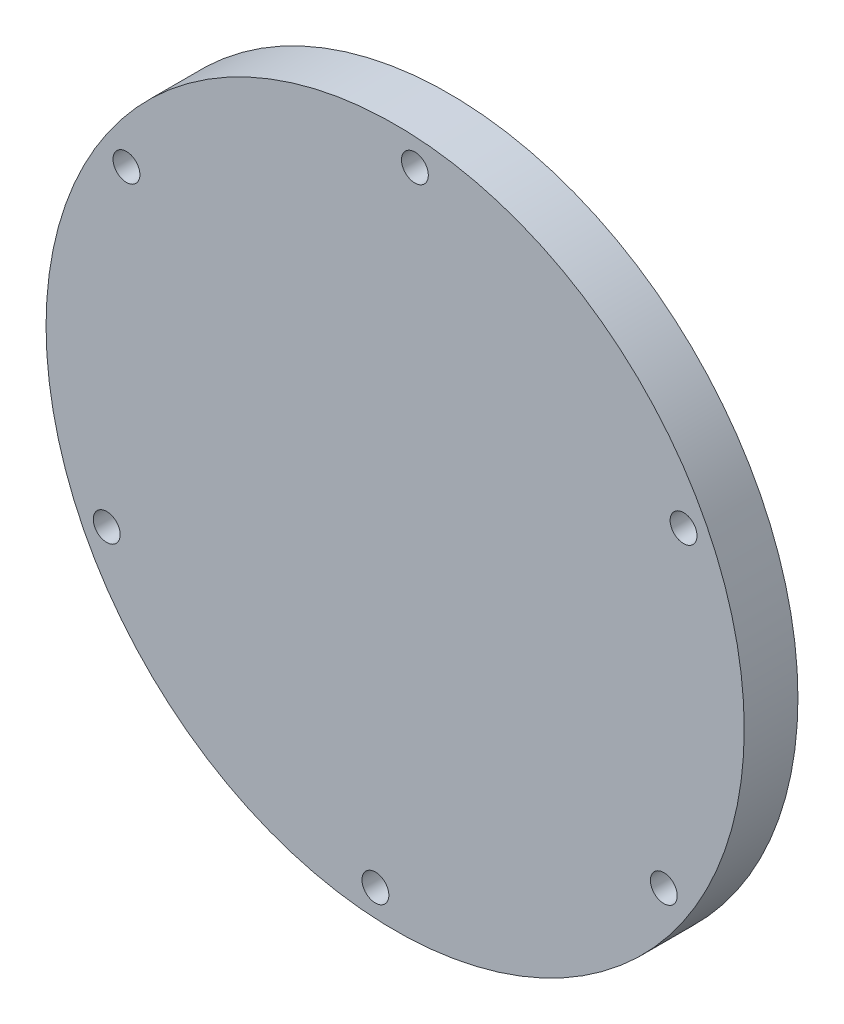
ISO-10303-21;
HEADER;
FILE_DESCRIPTION(('STEP AP214'),'2;1');
FILE_NAME('part.step','',(''),(''),'','','');
FILE_SCHEMA(('AUTOMOTIVE_DESIGN { 1 0 10303 214 1 1 1 1 }'));
ENDSEC;
DATA;
#1=APPLICATION_CONTEXT('core data for automotive mechanical design processes');
#2=APPLICATION_PROTOCOL_DEFINITION('international standard','automotive_design',2000,#1);
#3=PRODUCT_CONTEXT('',#1,'mechanical');
#4=PRODUCT('Part','Part','',(#3));
#5=PRODUCT_RELATED_PRODUCT_CATEGORY('part','',(#4));
#6=PRODUCT_DEFINITION_FORMATION('','',#4);
#7=PRODUCT_DEFINITION_CONTEXT('part definition',#1,'design');
#8=PRODUCT_DEFINITION('design','',#6,#7);
#9=PRODUCT_DEFINITION_SHAPE('','',#8);
#10=(LENGTH_UNIT() NAMED_UNIT(*) SI_UNIT(.MILLI.,.METRE.));
#11=(NAMED_UNIT(*) PLANE_ANGLE_UNIT() SI_UNIT($,.RADIAN.));
#12=(NAMED_UNIT(*) SI_UNIT($,.STERADIAN.) SOLID_ANGLE_UNIT());
#13=UNCERTAINTY_MEASURE_WITH_UNIT(LENGTH_MEASURE(1.E-05),#10,'distance_accuracy_value','');
#14=(GEOMETRIC_REPRESENTATION_CONTEXT(3) GLOBAL_UNCERTAINTY_ASSIGNED_CONTEXT((#13)) GLOBAL_UNIT_ASSIGNED_CONTEXT((#10,
#11,#12)) REPRESENTATION_CONTEXT('',''));
#15=CARTESIAN_POINT('',(0.,0.,0.));
#16=DIRECTION('',(0.,0.,1.));
#17=DIRECTION('',(1.,0.,0.));
#18=AXIS2_PLACEMENT_3D('',#15,#16,#17);
#19=CARTESIAN_POINT('',(-50.0261760262943,33.1267522130713,10.001));
#20=DIRECTION('',(0.,0.,-1.));
#21=DIRECTION('',(-1.,0.,0.));
#22=AXIS2_PLACEMENT_3D('',#19,#20,#21);
#23=CYLINDRICAL_SURFACE('',#22,2.5);
#24=CARTESIAN_POINT('',(-50.0261760262943,33.1267522130713,10.));
#25=DIRECTION('',(0.,0.,1.));
#26=DIRECTION('',(1.,0.,0.));
#27=AXIS2_PLACEMENT_3D('',#24,#25,#26);
#28=CIRCLE('',#27,2.5);
#29=CARTESIAN_POINT('',(-47.5261760262943,33.1267522130713,10.));
#30=VERTEX_POINT('',#29);
#31=EDGE_CURVE('E62',#30,#30,#28,.F.);
#32=ORIENTED_EDGE('',*,*,#31,.F.);
#33=EDGE_LOOP('',(#32));
#34=FACE_BOUND('',#33,.T.);
#35=CARTESIAN_POINT('',(-50.0261760262943,33.1267522130713,5.));
#36=DIRECTION('',(0.,0.,-1.));
#37=DIRECTION('',(-1.,0.,0.));
#38=AXIS2_PLACEMENT_3D('',#35,#36,#37);
#39=CIRCLE('',#38,2.5);
#40=CARTESIAN_POINT('',(-52.5261760262943,33.1267522130713,5.));
#41=VERTEX_POINT('',#40);
#42=EDGE_CURVE('E48',#41,#41,#39,.F.);
#43=ORIENTED_EDGE('',*,*,#42,.F.);
#44=EDGE_LOOP('',(#43));
#45=FACE_BOUND('',#44,.T.);
#46=ADVANCED_FACE('F44',(#34,#45),#23,.F.);
#47=CARTESIAN_POINT('',(-53.7016969745392,-26.7605631864274,10.001));
#48=DIRECTION('',(0.,0.,-1.));
#49=DIRECTION('',(-1.,0.,0.));
#50=AXIS2_PLACEMENT_3D('',#47,#48,#49);
#51=CYLINDRICAL_SURFACE('',#50,2.5);
#52=CARTESIAN_POINT('',(-53.7016969745392,-26.7605631864274,10.));
#53=DIRECTION('',(0.,0.,1.));
#54=DIRECTION('',(1.,0.,0.));
#55=AXIS2_PLACEMENT_3D('',#52,#53,#54);
#56=CIRCLE('',#55,2.5);
#57=CARTESIAN_POINT('',(-51.2016969745392,-26.7605631864274,10.));
#58=VERTEX_POINT('',#57);
#59=EDGE_CURVE('E88',#58,#58,#56,.F.);
#60=ORIENTED_EDGE('',*,*,#59,.F.);
#61=EDGE_LOOP('',(#60));
#62=FACE_BOUND('',#61,.T.);
#63=CARTESIAN_POINT('',(-53.7016969745392,-26.7605631864274,5.));
#64=DIRECTION('',(0.,0.,-1.));
#65=DIRECTION('',(-1.,0.,0.));
#66=AXIS2_PLACEMENT_3D('',#63,#64,#65);
#67=CIRCLE('',#66,2.5);
#68=CARTESIAN_POINT('',(-56.2016969745392,-26.7605631864274,5.));
#69=VERTEX_POINT('',#68);
#70=EDGE_CURVE('E77',#69,#69,#67,.F.);
#71=ORIENTED_EDGE('',*,*,#70,.F.);
#72=EDGE_LOOP('',(#71));
#73=FACE_BOUND('',#72,.T.);
#74=ADVANCED_FACE('F206',(#62,#73),#51,.F.);
#75=CARTESIAN_POINT('',(-3.67552094824468,-59.8873153994985,10.001));
#76=DIRECTION('',(0.,0.,-1.));
#77=DIRECTION('',(-1.,0.,0.));
#78=AXIS2_PLACEMENT_3D('',#75,#76,#77);
#79=CYLINDRICAL_SURFACE('',#78,2.5);
#80=CARTESIAN_POINT('',(-3.67552094824468,-59.8873153994985,10.));
#81=DIRECTION('',(0.,0.,1.));
#82=DIRECTION('',(1.,0.,0.));
#83=AXIS2_PLACEMENT_3D('',#80,#81,#82);
#84=CIRCLE('',#83,2.5);
#85=CARTESIAN_POINT('',(-1.17552094824468,-59.8873153994985,10.));
#86=VERTEX_POINT('',#85);
#87=EDGE_CURVE('E93',#86,#86,#84,.F.);
#88=ORIENTED_EDGE('',*,*,#87,.F.);
#89=EDGE_LOOP('',(#88));
#90=FACE_BOUND('',#89,.T.);
#91=CARTESIAN_POINT('',(-3.67552094824468,-59.8873153994985,5.));
#92=DIRECTION('',(0.,0.,-1.));
#93=DIRECTION('',(-1.,0.,0.));
#94=AXIS2_PLACEMENT_3D('',#91,#92,#93);
#95=CIRCLE('',#94,2.5);
#96=CARTESIAN_POINT('',(-6.17552094824468,-59.8873153994985,5.));
#97=VERTEX_POINT('',#96);
#98=EDGE_CURVE('E74',#97,#97,#95,.F.);
#99=ORIENTED_EDGE('',*,*,#98,.F.);
#100=EDGE_LOOP('',(#99));
#101=FACE_BOUND('',#100,.T.);
#102=ADVANCED_FACE('F212',(#90,#101),#79,.F.);
#103=CARTESIAN_POINT('',(50.0261760262945,-33.1267522130709,10.001));
#104=DIRECTION('',(0.,0.,-1.));
#105=DIRECTION('',(-1.,0.,0.));
#106=AXIS2_PLACEMENT_3D('',#103,#104,#105);
#107=CYLINDRICAL_SURFACE('',#106,2.5);
#108=CARTESIAN_POINT('',(50.0261760262945,-33.1267522130709,10.));
#109=DIRECTION('',(0.,0.,1.));
#110=DIRECTION('',(1.,0.,0.));
#111=AXIS2_PLACEMENT_3D('',#108,#109,#110);
#112=CIRCLE('',#111,2.5);
#113=CARTESIAN_POINT('',(52.5261760262945,-33.1267522130709,10.));
#114=VERTEX_POINT('',#113);
#115=EDGE_CURVE('E98',#114,#114,#112,.F.);
#116=ORIENTED_EDGE('',*,*,#115,.F.);
#117=EDGE_LOOP('',(#116));
#118=FACE_BOUND('',#117,.T.);
#119=CARTESIAN_POINT('',(50.0261760262945,-33.1267522130709,5.));
#120=DIRECTION('',(0.,0.,-1.));
#121=DIRECTION('',(-1.,0.,0.));
#122=AXIS2_PLACEMENT_3D('',#119,#120,#121);
#123=CIRCLE('',#122,2.5);
#124=CARTESIAN_POINT('',(47.5261760262945,-33.1267522130709,5.));
#125=VERTEX_POINT('',#124);
#126=EDGE_CURVE('E69',#125,#125,#123,.F.);
#127=ORIENTED_EDGE('',*,*,#126,.F.);
#128=EDGE_LOOP('',(#127));
#129=FACE_BOUND('',#128,.T.);
#130=ADVANCED_FACE('F219',(#118,#129),#107,.F.);
#131=CARTESIAN_POINT('',(53.701696974539,26.7605631864278,10.001));
#132=DIRECTION('',(0.,0.,-1.));
#133=DIRECTION('',(-1.,0.,0.));
#134=AXIS2_PLACEMENT_3D('',#131,#132,#133);
#135=CYLINDRICAL_SURFACE('',#134,2.5);
#136=CARTESIAN_POINT('',(53.701696974539,26.7605631864278,10.));
#137=DIRECTION('',(0.,0.,1.));
#138=DIRECTION('',(1.,0.,0.));
#139=AXIS2_PLACEMENT_3D('',#136,#137,#138);
#140=CIRCLE('',#139,2.5);
#141=CARTESIAN_POINT('',(56.201696974539,26.7605631864278,10.));
#142=VERTEX_POINT('',#141);
#143=EDGE_CURVE('E104',#142,#142,#140,.F.);
#144=ORIENTED_EDGE('',*,*,#143,.F.);
#145=EDGE_LOOP('',(#144));
#146=FACE_BOUND('',#145,.T.);
#147=CARTESIAN_POINT('',(53.701696974539,26.7605631864278,5.));
#148=DIRECTION('',(0.,0.,-1.));
#149=DIRECTION('',(-1.,0.,0.));
#150=AXIS2_PLACEMENT_3D('',#147,#148,#149);
#151=CIRCLE('',#150,2.5);
#152=CARTESIAN_POINT('',(51.201696974539,26.7605631864278,5.));
#153=VERTEX_POINT('',#152);
#154=EDGE_CURVE('E65',#153,#153,#151,.F.);
#155=ORIENTED_EDGE('',*,*,#154,.F.);
#156=EDGE_LOOP('',(#155));
#157=FACE_BOUND('',#156,.T.);
#158=ADVANCED_FACE('F202',(#146,#157),#135,.F.);
#159=CARTESIAN_POINT('',(3.6755209482451,59.8873153994985,10.001));
#160=DIRECTION('',(0.,0.,-1.));
#161=DIRECTION('',(-1.,0.,0.));
#162=AXIS2_PLACEMENT_3D('',#159,#160,#161);
#163=CYLINDRICAL_SURFACE('',#162,2.5);
#164=CARTESIAN_POINT('',(3.6755209482451,59.8873153994985,10.));
#165=DIRECTION('',(0.,0.,1.));
#166=DIRECTION('',(1.,0.,0.));
#167=AXIS2_PLACEMENT_3D('',#164,#165,#166);
#168=CIRCLE('',#167,2.5);
#169=CARTESIAN_POINT('',(6.1755209482451,59.8873153994985,10.));
#170=VERTEX_POINT('',#169);
#171=EDGE_CURVE('E59',#170,#170,#168,.F.);
#172=ORIENTED_EDGE('',*,*,#171,.F.);
#173=EDGE_LOOP('',(#172));
#174=FACE_BOUND('',#173,.T.);
#175=CARTESIAN_POINT('',(3.6755209482451,59.8873153994985,5.));
#176=DIRECTION('',(0.,0.,-1.));
#177=DIRECTION('',(-1.,0.,0.));
#178=AXIS2_PLACEMENT_3D('',#175,#176,#177);
#179=CIRCLE('',#178,2.5);
#180=CARTESIAN_POINT('',(1.1755209482451,59.8873153994985,5.));
#181=VERTEX_POINT('',#180);
#182=EDGE_CURVE('E144',#181,#181,#179,.T.);
#183=ORIENTED_EDGE('',*,*,#182,.T.);
#184=EDGE_LOOP('',(#183));
#185=FACE_BOUND('',#184,.T.);
#186=ADVANCED_FACE('F163',(#174,#185),#163,.F.);
#187=CARTESIAN_POINT('',(0.,0.,10.));
#188=DIRECTION('',(0.,0.,-1.));
#189=DIRECTION('',(-1.,0.,0.));
#190=AXIS2_PLACEMENT_3D('',#187,#188,#189);
#191=CYLINDRICAL_SURFACE('',#190,65.);
#192=CARTESIAN_POINT('',(0.,0.,10.));
#193=DIRECTION('',(0.,0.,1.));
#194=DIRECTION('',(1.,0.,0.));
#195=AXIS2_PLACEMENT_3D('',#192,#193,#194);
#196=CIRCLE('',#195,65.);
#197=CARTESIAN_POINT('',(65.,0.,10.));
#198=VERTEX_POINT('',#197);
#199=EDGE_CURVE('E11',#198,#198,#196,.T.);
#200=ORIENTED_EDGE('',*,*,#199,.F.);
#201=EDGE_LOOP('',(#200));
#202=FACE_BOUND('',#201,.T.);
#203=CARTESIAN_POINT('',(0.,0.,0.));
#204=DIRECTION('',(0.,0.,1.));
#205=DIRECTION('',(1.,0.,0.));
#206=AXIS2_PLACEMENT_3D('',#203,#204,#205);
#207=CIRCLE('',#206,65.);
#208=CARTESIAN_POINT('',(65.,0.,0.));
#209=VERTEX_POINT('',#208);
#210=EDGE_CURVE('E53',#209,#209,#207,.T.);
#211=ORIENTED_EDGE('',*,*,#210,.T.);
#212=EDGE_LOOP('',(#211));
#213=FACE_BOUND('',#212,.T.);
#214=ADVANCED_FACE('F46',(#202,#213),#191,.T.);
#215=CARTESIAN_POINT('',(0.,0.,10.));
#216=DIRECTION('',(0.,0.,1.));
#217=DIRECTION('',(1.,0.,0.));
#218=AXIS2_PLACEMENT_3D('',#215,#216,#217);
#219=PLANE('',#218);
#220=ORIENTED_EDGE('',*,*,#171,.T.);
#221=EDGE_LOOP('',(#220));
#222=FACE_BOUND('',#221,.T.);
#223=ORIENTED_EDGE('',*,*,#143,.T.);
#224=EDGE_LOOP('',(#223));
#225=FACE_BOUND('',#224,.T.);
#226=ORIENTED_EDGE('',*,*,#115,.T.);
#227=EDGE_LOOP('',(#226));
#228=FACE_BOUND('',#227,.T.);
#229=ORIENTED_EDGE('',*,*,#87,.T.);
#230=EDGE_LOOP('',(#229));
#231=FACE_BOUND('',#230,.T.);
#232=ORIENTED_EDGE('',*,*,#59,.T.);
#233=EDGE_LOOP('',(#232));
#234=FACE_BOUND('',#233,.T.);
#235=ORIENTED_EDGE('',*,*,#31,.T.);
#236=EDGE_LOOP('',(#235));
#237=FACE_BOUND('',#236,.T.);
#238=ORIENTED_EDGE('',*,*,#199,.T.);
#239=EDGE_LOOP('',(#238));
#240=FACE_BOUND('',#239,.T.);
#241=ADVANCED_FACE('F181',(#222,#225,#228,#231,#234,#237,#240),#219,.T.);
#242=CARTESIAN_POINT('',(0.,0.,0.));
#243=DIRECTION('',(0.,0.,1.));
#244=DIRECTION('',(1.,0.,0.));
#245=AXIS2_PLACEMENT_3D('',#242,#243,#244);
#246=PLANE('',#245);
#247=CARTESIAN_POINT('',(3.6755209482451,59.8873153994985,0.));
#248=DIRECTION('',(0.,0.,-1.));
#249=DIRECTION('',(-1.,0.,0.));
#250=AXIS2_PLACEMENT_3D('',#247,#248,#249);
#251=CIRCLE('',#250,4.);
#252=CARTESIAN_POINT('',(-0.324479051754901,59.8873153994985,0.));
#253=VERTEX_POINT('',#252);
#254=EDGE_CURVE('E152',#253,#253,#251,.T.);
#255=ORIENTED_EDGE('',*,*,#254,.F.);
#256=EDGE_LOOP('',(#255));
#257=FACE_BOUND('',#256,.T.);
#258=CARTESIAN_POINT('',(53.701696974539,26.7605631864278,0.));
#259=DIRECTION('',(0.,0.,-1.));
#260=DIRECTION('',(-1.,0.,0.));
#261=AXIS2_PLACEMENT_3D('',#258,#259,#260);
#262=CIRCLE('',#261,4.00000000000001);
#263=CARTESIAN_POINT('',(49.701696974539,26.7605631864278,0.));
#264=VERTEX_POINT('',#263);
#265=EDGE_CURVE('E116',#264,#264,#262,.T.);
#266=ORIENTED_EDGE('',*,*,#265,.F.);
#267=EDGE_LOOP('',(#266));
#268=FACE_BOUND('',#267,.T.);
#269=CARTESIAN_POINT('',(50.0261760262945,-33.1267522130709,0.));
#270=DIRECTION('',(0.,0.,-1.));
#271=DIRECTION('',(-1.,0.,0.));
#272=AXIS2_PLACEMENT_3D('',#269,#270,#271);
#273=CIRCLE('',#272,4.);
#274=CARTESIAN_POINT('',(46.0261760262945,-33.1267522130709,0.));
#275=VERTEX_POINT('',#274);
#276=EDGE_CURVE('E115',#275,#275,#273,.T.);
#277=ORIENTED_EDGE('',*,*,#276,.F.);
#278=EDGE_LOOP('',(#277));
#279=FACE_BOUND('',#278,.T.);
#280=CARTESIAN_POINT('',(-3.67552094824468,-59.8873153994985,0.));
#281=DIRECTION('',(0.,0.,-1.));
#282=DIRECTION('',(-1.,0.,0.));
#283=AXIS2_PLACEMENT_3D('',#280,#281,#282);
#284=CIRCLE('',#283,4.);
#285=CARTESIAN_POINT('',(-7.67552094824468,-59.8873153994985,0.));
#286=VERTEX_POINT('',#285);
#287=EDGE_CURVE('E124',#286,#286,#284,.T.);
#288=ORIENTED_EDGE('',*,*,#287,.F.);
#289=EDGE_LOOP('',(#288));
#290=FACE_BOUND('',#289,.T.);
#291=CARTESIAN_POINT('',(-53.7016969745392,-26.7605631864274,0.));
#292=DIRECTION('',(0.,0.,-1.));
#293=DIRECTION('',(-1.,0.,0.));
#294=AXIS2_PLACEMENT_3D('',#291,#292,#293);
#295=CIRCLE('',#294,4.);
#296=CARTESIAN_POINT('',(-57.7016969745392,-26.7605631864274,0.));
#297=VERTEX_POINT('',#296);
#298=EDGE_CURVE('E132',#297,#297,#295,.T.);
#299=ORIENTED_EDGE('',*,*,#298,.F.);
#300=EDGE_LOOP('',(#299));
#301=FACE_BOUND('',#300,.T.);
#302=CARTESIAN_POINT('',(-50.0261760262943,33.1267522130713,0.));
#303=DIRECTION('',(0.,0.,-1.));
#304=DIRECTION('',(-1.,0.,0.));
#305=AXIS2_PLACEMENT_3D('',#302,#303,#304);
#306=CIRCLE('',#305,4.);
#307=CARTESIAN_POINT('',(-54.0261760262943,33.1267522130713,0.));
#308=VERTEX_POINT('',#307);
#309=EDGE_CURVE('E140',#308,#308,#306,.T.);
#310=ORIENTED_EDGE('',*,*,#309,.F.);
#311=EDGE_LOOP('',(#310));
#312=FACE_BOUND('',#311,.T.);
#313=ORIENTED_EDGE('',*,*,#210,.F.);
#314=EDGE_LOOP('',(#313));
#315=FACE_BOUND('',#314,.T.);
#316=ADVANCED_FACE('F175',(#257,#268,#279,#290,#301,#312,#315),#246,.F.);
#317=CARTESIAN_POINT('',(3.6755209482451,59.8873153994985,5.));
#318=DIRECTION('',(0.,0.,-1.));
#319=DIRECTION('',(-1.,0.,0.));
#320=AXIS2_PLACEMENT_3D('',#317,#318,#319);
#321=CYLINDRICAL_SURFACE('',#320,4.);
#322=CARTESIAN_POINT('',(3.6755209482451,59.8873153994985,5.));
#323=DIRECTION('',(0.,0.,-1.));
#324=DIRECTION('',(-1.,0.,0.));
#325=AXIS2_PLACEMENT_3D('',#322,#323,#324);
#326=CIRCLE('',#325,4.);
#327=CARTESIAN_POINT('',(-0.324479051754901,59.8873153994985,5.));
#328=VERTEX_POINT('',#327);
#329=EDGE_CURVE('E70',#328,#328,#326,.T.);
#330=ORIENTED_EDGE('',*,*,#329,.F.);
#331=EDGE_LOOP('',(#330));
#332=FACE_BOUND('',#331,.T.);
#333=ORIENTED_EDGE('',*,*,#254,.T.);
#334=EDGE_LOOP('',(#333));
#335=FACE_BOUND('',#334,.T.);
#336=ADVANCED_FACE('F169',(#332,#335),#321,.F.);
#337=CARTESIAN_POINT('',(3.6755209482451,59.8873153994985,5.));
#338=DIRECTION('',(0.,0.,-1.));
#339=DIRECTION('',(-1.,0.,0.));
#340=AXIS2_PLACEMENT_3D('',#337,#338,#339);
#341=PLANE('',#340);
#342=ORIENTED_EDGE('',*,*,#182,.F.);
#343=EDGE_LOOP('',(#342));
#344=FACE_BOUND('',#343,.T.);
#345=ORIENTED_EDGE('',*,*,#329,.T.);
#346=EDGE_LOOP('',(#345));
#347=FACE_BOUND('',#346,.T.);
#348=ADVANCED_FACE('F165',(#344,#347),#341,.T.);
#349=CARTESIAN_POINT('',(53.701696974539,26.7605631864278,5.));
#350=DIRECTION('',(0.,0.,-1.));
#351=DIRECTION('',(-1.,0.,0.));
#352=AXIS2_PLACEMENT_3D('',#349,#350,#351);
#353=PLANE('',#352);
#354=CARTESIAN_POINT('',(53.701696974539,26.7605631864278,5.));
#355=DIRECTION('',(0.,0.,-1.));
#356=DIRECTION('',(-1.,0.,0.));
#357=AXIS2_PLACEMENT_3D('',#354,#355,#356);
#358=CIRCLE('',#357,4.00000000000001);
#359=CARTESIAN_POINT('',(49.701696974539,26.7605631864278,5.));
#360=VERTEX_POINT('',#359);
#361=EDGE_CURVE('E145',#360,#360,#358,.T.);
#362=ORIENTED_EDGE('',*,*,#361,.T.);
#363=EDGE_LOOP('',(#362));
#364=FACE_BOUND('',#363,.T.);
#365=ORIENTED_EDGE('',*,*,#154,.T.);
#366=EDGE_LOOP('',(#365));
#367=FACE_BOUND('',#366,.T.);
#368=ADVANCED_FACE('F168',(#364,#367),#353,.T.);
#369=CARTESIAN_POINT('',(53.701696974539,26.7605631864278,5.));
#370=DIRECTION('',(0.,0.,-1.));
#371=DIRECTION('',(-1.,0.,0.));
#372=AXIS2_PLACEMENT_3D('',#369,#370,#371);
#373=CYLINDRICAL_SURFACE('',#372,4.00000000000001);
#374=ORIENTED_EDGE('',*,*,#361,.F.);
#375=EDGE_LOOP('',(#374));
#376=FACE_BOUND('',#375,.T.);
#377=ORIENTED_EDGE('',*,*,#265,.T.);
#378=EDGE_LOOP('',(#377));
#379=FACE_BOUND('',#378,.T.);
#380=ADVANCED_FACE('F231',(#376,#379),#373,.F.);
#381=CARTESIAN_POINT('',(50.0261760262945,-33.1267522130709,5.));
#382=DIRECTION('',(0.,0.,-1.));
#383=DIRECTION('',(-1.,0.,0.));
#384=AXIS2_PLACEMENT_3D('',#381,#382,#383);
#385=PLANE('',#384);
#386=CARTESIAN_POINT('',(50.0261760262945,-33.1267522130709,5.));
#387=DIRECTION('',(0.,0.,-1.));
#388=DIRECTION('',(-1.,0.,0.));
#389=AXIS2_PLACEMENT_3D('',#386,#387,#388);
#390=CIRCLE('',#389,4.);
#391=CARTESIAN_POINT('',(46.0261760262945,-33.1267522130709,5.));
#392=VERTEX_POINT('',#391);
#393=EDGE_CURVE('E111',#392,#392,#390,.T.);
#394=ORIENTED_EDGE('',*,*,#393,.T.);
#395=EDGE_LOOP('',(#394));
#396=FACE_BOUND('',#395,.T.);
#397=ORIENTED_EDGE('',*,*,#126,.T.);
#398=EDGE_LOOP('',(#397));
#399=FACE_BOUND('',#398,.T.);
#400=ADVANCED_FACE('F227',(#396,#399),#385,.T.);
#401=CARTESIAN_POINT('',(50.0261760262945,-33.1267522130709,5.));
#402=DIRECTION('',(0.,0.,-1.));
#403=DIRECTION('',(-1.,0.,0.));
#404=AXIS2_PLACEMENT_3D('',#401,#402,#403);
#405=CYLINDRICAL_SURFACE('',#404,4.);
#406=ORIENTED_EDGE('',*,*,#393,.F.);
#407=EDGE_LOOP('',(#406));
#408=FACE_BOUND('',#407,.T.);
#409=ORIENTED_EDGE('',*,*,#276,.T.);
#410=EDGE_LOOP('',(#409));
#411=FACE_BOUND('',#410,.T.);
#412=ADVANCED_FACE('F230',(#408,#411),#405,.F.);
#413=CARTESIAN_POINT('',(-3.67552094824468,-59.8873153994985,5.));
#414=DIRECTION('',(0.,0.,-1.));
#415=DIRECTION('',(-1.,0.,0.));
#416=AXIS2_PLACEMENT_3D('',#413,#414,#415);
#417=PLANE('',#416);
#418=CARTESIAN_POINT('',(-3.67552094824468,-59.8873153994985,5.));
#419=DIRECTION('',(0.,0.,-1.));
#420=DIRECTION('',(-1.,0.,0.));
#421=AXIS2_PLACEMENT_3D('',#418,#419,#420);
#422=CIRCLE('',#421,4.);
#423=CARTESIAN_POINT('',(-7.67552094824468,-59.8873153994985,5.));
#424=VERTEX_POINT('',#423);
#425=EDGE_CURVE('E120',#424,#424,#422,.T.);
#426=ORIENTED_EDGE('',*,*,#425,.T.);
#427=EDGE_LOOP('',(#426));
#428=FACE_BOUND('',#427,.T.);
#429=ORIENTED_EDGE('',*,*,#98,.T.);
#430=EDGE_LOOP('',(#429));
#431=FACE_BOUND('',#430,.T.);
#432=ADVANCED_FACE('F235',(#428,#431),#417,.T.);
#433=CARTESIAN_POINT('',(-3.67552094824468,-59.8873153994985,5.));
#434=DIRECTION('',(0.,0.,-1.));
#435=DIRECTION('',(-1.,0.,0.));
#436=AXIS2_PLACEMENT_3D('',#433,#434,#435);
#437=CYLINDRICAL_SURFACE('',#436,4.);
#438=ORIENTED_EDGE('',*,*,#425,.F.);
#439=EDGE_LOOP('',(#438));
#440=FACE_BOUND('',#439,.T.);
#441=ORIENTED_EDGE('',*,*,#287,.T.);
#442=EDGE_LOOP('',(#441));
#443=FACE_BOUND('',#442,.T.);
#444=ADVANCED_FACE('F239',(#440,#443),#437,.F.);
#445=CARTESIAN_POINT('',(-53.7016969745392,-26.7605631864274,5.));
#446=DIRECTION('',(0.,0.,-1.));
#447=DIRECTION('',(-1.,0.,0.));
#448=AXIS2_PLACEMENT_3D('',#445,#446,#447);
#449=PLANE('',#448);
#450=CARTESIAN_POINT('',(-53.7016969745392,-26.7605631864274,5.));
#451=DIRECTION('',(0.,0.,-1.));
#452=DIRECTION('',(-1.,0.,0.));
#453=AXIS2_PLACEMENT_3D('',#450,#451,#452);
#454=CIRCLE('',#453,4.);
#455=CARTESIAN_POINT('',(-57.7016969745392,-26.7605631864274,5.));
#456=VERTEX_POINT('',#455);
#457=EDGE_CURVE('E128',#456,#456,#454,.T.);
#458=ORIENTED_EDGE('',*,*,#457,.T.);
#459=EDGE_LOOP('',(#458));
#460=FACE_BOUND('',#459,.T.);
#461=ORIENTED_EDGE('',*,*,#70,.T.);
#462=EDGE_LOOP('',(#461));
#463=FACE_BOUND('',#462,.T.);
#464=ADVANCED_FACE('F243',(#460,#463),#449,.T.);
#465=CARTESIAN_POINT('',(-53.7016969745392,-26.7605631864274,5.));
#466=DIRECTION('',(0.,0.,-1.));
#467=DIRECTION('',(-1.,0.,0.));
#468=AXIS2_PLACEMENT_3D('',#465,#466,#467);
#469=CYLINDRICAL_SURFACE('',#468,4.);
#470=ORIENTED_EDGE('',*,*,#457,.F.);
#471=EDGE_LOOP('',(#470));
#472=FACE_BOUND('',#471,.T.);
#473=ORIENTED_EDGE('',*,*,#298,.T.);
#474=EDGE_LOOP('',(#473));
#475=FACE_BOUND('',#474,.T.);
#476=ADVANCED_FACE('F247',(#472,#475),#469,.F.);
#477=CARTESIAN_POINT('',(-50.0261760262943,33.1267522130713,5.));
#478=DIRECTION('',(0.,0.,-1.));
#479=DIRECTION('',(-1.,0.,0.));
#480=AXIS2_PLACEMENT_3D('',#477,#478,#479);
#481=PLANE('',#480);
#482=CARTESIAN_POINT('',(-50.0261760262943,33.1267522130713,5.));
#483=DIRECTION('',(0.,0.,-1.));
#484=DIRECTION('',(-1.,0.,0.));
#485=AXIS2_PLACEMENT_3D('',#482,#483,#484);
#486=CIRCLE('',#485,4.);
#487=CARTESIAN_POINT('',(-54.0261760262943,33.1267522130713,5.));
#488=VERTEX_POINT('',#487);
#489=EDGE_CURVE('E136',#488,#488,#486,.T.);
#490=ORIENTED_EDGE('',*,*,#489,.T.);
#491=EDGE_LOOP('',(#490));
#492=FACE_BOUND('',#491,.T.);
#493=ORIENTED_EDGE('',*,*,#42,.T.);
#494=EDGE_LOOP('',(#493));
#495=FACE_BOUND('',#494,.T.);
#496=ADVANCED_FACE('F251',(#492,#495),#481,.T.);
#497=CARTESIAN_POINT('',(-50.0261760262943,33.1267522130713,5.));
#498=DIRECTION('',(0.,0.,-1.));
#499=DIRECTION('',(-1.,0.,0.));
#500=AXIS2_PLACEMENT_3D('',#497,#498,#499);
#501=CYLINDRICAL_SURFACE('',#500,4.);
#502=ORIENTED_EDGE('',*,*,#489,.F.);
#503=EDGE_LOOP('',(#502));
#504=FACE_BOUND('',#503,.T.);
#505=ORIENTED_EDGE('',*,*,#309,.T.);
#506=EDGE_LOOP('',(#505));
#507=FACE_BOUND('',#506,.T.);
#508=ADVANCED_FACE('F255',(#504,#507),#501,.F.);
#509=CLOSED_SHELL('',(#46,#74,#102,#130,#158,#186,#214,#241,#316,#336,#348,#368,#380,#400,#412,
#432,#444,#464,#476,#496,#508));
#510=MANIFOLD_SOLID_BREP('B2',#509);
#511=ADVANCED_BREP_SHAPE_REPRESENTATION('',(#18,#510),#14);
#512=SHAPE_DEFINITION_REPRESENTATION(#9,#511);
ENDSEC;
END-ISO-10303-21;
